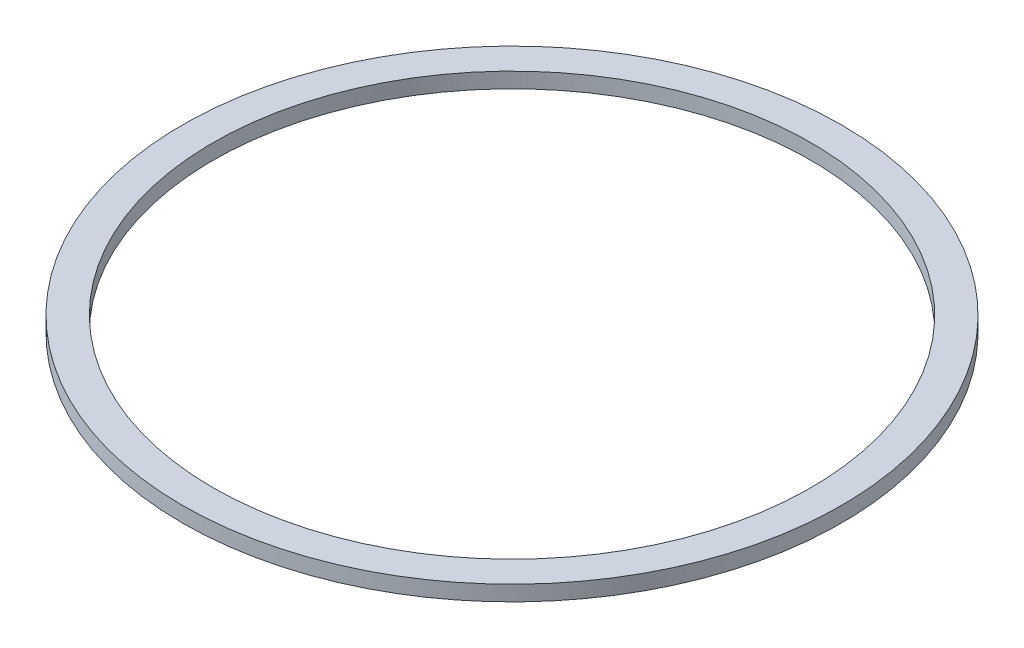
ISO-10303-21;
HEADER;
FILE_DESCRIPTION(('STEP AP214'),'2;1');
FILE_NAME('part.step','',(''),(''),'','','');
FILE_SCHEMA(('AUTOMOTIVE_DESIGN { 1 0 10303 214 1 1 1 1 }'));
ENDSEC;
DATA;
#1=APPLICATION_CONTEXT('core data for automotive mechanical design processes');
#2=APPLICATION_PROTOCOL_DEFINITION('international standard','automotive_design',2000,#1);
#3=PRODUCT_CONTEXT('',#1,'mechanical');
#4=PRODUCT('Part','Part','',(#3));
#5=PRODUCT_RELATED_PRODUCT_CATEGORY('part','',(#4));
#6=PRODUCT_DEFINITION_FORMATION('','',#4);
#7=PRODUCT_DEFINITION_CONTEXT('part definition',#1,'design');
#8=PRODUCT_DEFINITION('design','',#6,#7);
#9=PRODUCT_DEFINITION_SHAPE('','',#8);
#10=(LENGTH_UNIT() NAMED_UNIT(*) SI_UNIT(.MILLI.,.METRE.));
#11=(NAMED_UNIT(*) PLANE_ANGLE_UNIT() SI_UNIT($,.RADIAN.));
#12=(NAMED_UNIT(*) SI_UNIT($,.STERADIAN.) SOLID_ANGLE_UNIT());
#13=UNCERTAINTY_MEASURE_WITH_UNIT(LENGTH_MEASURE(1.E-05),#10,'distance_accuracy_value','');
#14=(GEOMETRIC_REPRESENTATION_CONTEXT(3) GLOBAL_UNCERTAINTY_ASSIGNED_CONTEXT((#13)) GLOBAL_UNIT_ASSIGNED_CONTEXT((#10,
#11,#12)) REPRESENTATION_CONTEXT('',''));
#15=CARTESIAN_POINT('',(0.,0.,0.));
#16=DIRECTION('',(0.,0.,1.));
#17=DIRECTION('',(1.,0.,0.));
#18=AXIS2_PLACEMENT_3D('',#15,#16,#17);
#19=CARTESIAN_POINT('',(0.,1.,0.));
#20=DIRECTION('',(0.,1.,0.));
#21=DIRECTION('',(0.,0.,1.));
#22=AXIS2_PLACEMENT_3D('',#19,#20,#21);
#23=PLANE('',#22);
#24=CARTESIAN_POINT('',(0.,1.,0.));
#25=DIRECTION('',(0.,1.,0.));
#26=DIRECTION('',(0.,0.,1.));
#27=AXIS2_PLACEMENT_3D('',#24,#25,#26);
#28=CIRCLE('',#27,21.5);
#29=CARTESIAN_POINT('',(0.,1.,21.5));
#30=VERTEX_POINT('',#29);
#31=EDGE_CURVE('E10',#30,#30,#28,.T.);
#32=ORIENTED_EDGE('',*,*,#31,.T.);
#33=EDGE_LOOP('',(#32));
#34=FACE_BOUND('',#33,.T.);
#35=CARTESIAN_POINT('',(0.,1.,0.));
#36=DIRECTION('',(0.,1.,0.));
#37=DIRECTION('',(0.,0.,1.));
#38=AXIS2_PLACEMENT_3D('',#35,#36,#37);
#39=CIRCLE('',#38,19.5);
#40=CARTESIAN_POINT('',(0.,1.,19.5));
#41=VERTEX_POINT('',#40);
#42=EDGE_CURVE('E50',#41,#41,#39,.T.);
#43=ORIENTED_EDGE('',*,*,#42,.F.);
#44=EDGE_LOOP('',(#43));
#45=FACE_BOUND('',#44,.T.);
#46=ADVANCED_FACE('F37',(#34,#45),#23,.T.);
#47=CARTESIAN_POINT('',(0.,0.,0.));
#48=DIRECTION('',(0.,1.,0.));
#49=DIRECTION('',(0.,0.,1.));
#50=AXIS2_PLACEMENT_3D('',#47,#48,#49);
#51=PLANE('',#50);
#52=CARTESIAN_POINT('',(0.,0.,0.));
#53=DIRECTION('',(0.,1.,0.));
#54=DIRECTION('',(0.,0.,1.));
#55=AXIS2_PLACEMENT_3D('',#52,#53,#54);
#56=CIRCLE('',#55,21.5);
#57=CARTESIAN_POINT('',(0.,0.,21.5));
#58=VERTEX_POINT('',#57);
#59=EDGE_CURVE('E41',#58,#58,#56,.T.);
#60=ORIENTED_EDGE('',*,*,#59,.F.);
#61=EDGE_LOOP('',(#60));
#62=FACE_BOUND('',#61,.T.);
#63=CARTESIAN_POINT('',(0.,0.,0.));
#64=DIRECTION('',(0.,1.,0.));
#65=DIRECTION('',(0.,0.,1.));
#66=AXIS2_PLACEMENT_3D('',#63,#64,#65);
#67=CIRCLE('',#66,19.5);
#68=CARTESIAN_POINT('',(0.,0.,19.5));
#69=VERTEX_POINT('',#68);
#70=EDGE_CURVE('E52',#69,#69,#67,.T.);
#71=ORIENTED_EDGE('',*,*,#70,.T.);
#72=EDGE_LOOP('',(#71));
#73=FACE_BOUND('',#72,.T.);
#74=ADVANCED_FACE('F64',(#62,#73),#51,.F.);
#75=CARTESIAN_POINT('',(0.,1.,0.));
#76=DIRECTION('',(0.,-1.,0.));
#77=DIRECTION('',(0.,0.,-1.));
#78=AXIS2_PLACEMENT_3D('',#75,#76,#77);
#79=CYLINDRICAL_SURFACE('',#78,21.5);
#80=ORIENTED_EDGE('',*,*,#31,.F.);
#81=EDGE_LOOP('',(#80));
#82=FACE_BOUND('',#81,.T.);
#83=ORIENTED_EDGE('',*,*,#59,.T.);
#84=EDGE_LOOP('',(#83));
#85=FACE_BOUND('',#84,.T.);
#86=ADVANCED_FACE('F39',(#82,#85),#79,.T.);
#87=CARTESIAN_POINT('',(0.,1.,0.));
#88=DIRECTION('',(0.,-1.,0.));
#89=DIRECTION('',(0.,0.,-1.));
#90=AXIS2_PLACEMENT_3D('',#87,#88,#89);
#91=CYLINDRICAL_SURFACE('',#90,19.5);
#92=ORIENTED_EDGE('',*,*,#42,.T.);
#93=EDGE_LOOP('',(#92));
#94=FACE_BOUND('',#93,.T.);
#95=ORIENTED_EDGE('',*,*,#70,.F.);
#96=EDGE_LOOP('',(#95));
#97=FACE_BOUND('',#96,.T.);
#98=ADVANCED_FACE('F60',(#94,#97),#91,.F.);
#99=CLOSED_SHELL('',(#46,#74,#86,#98));
#100=MANIFOLD_SOLID_BREP('B2',#99);
#101=ADVANCED_BREP_SHAPE_REPRESENTATION('',(#18,#100),#14);
#102=SHAPE_DEFINITION_REPRESENTATION(#9,#101);
ENDSEC;
END-ISO-10303-21;
